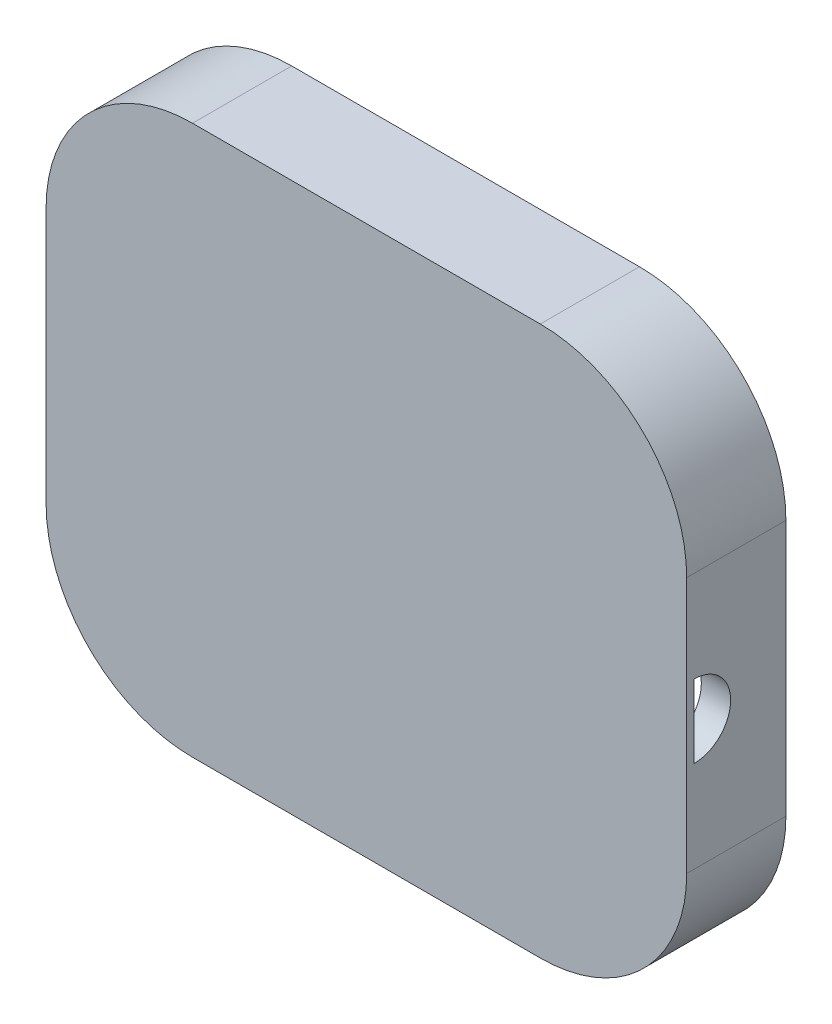
ISO-10303-21;
HEADER;
FILE_DESCRIPTION(('STEP AP214'),'2;1');
FILE_NAME('part.step','',(''),(''),'','','');
FILE_SCHEMA(('AUTOMOTIVE_DESIGN { 1 0 10303 214 1 1 1 1 }'));
ENDSEC;
DATA;
#1=APPLICATION_CONTEXT('core data for automotive mechanical design processes');
#2=APPLICATION_PROTOCOL_DEFINITION('international standard','automotive_design',2000,#1);
#3=PRODUCT_CONTEXT('',#1,'mechanical');
#4=PRODUCT('Part','Part','',(#3));
#5=PRODUCT_RELATED_PRODUCT_CATEGORY('part','',(#4));
#6=PRODUCT_DEFINITION_FORMATION('','',#4);
#7=PRODUCT_DEFINITION_CONTEXT('part definition',#1,'design');
#8=PRODUCT_DEFINITION('design','',#6,#7);
#9=PRODUCT_DEFINITION_SHAPE('','',#8);
#10=(LENGTH_UNIT() NAMED_UNIT(*) SI_UNIT(.MILLI.,.METRE.));
#11=(NAMED_UNIT(*) PLANE_ANGLE_UNIT() SI_UNIT($,.RADIAN.));
#12=(NAMED_UNIT(*) SI_UNIT($,.STERADIAN.) SOLID_ANGLE_UNIT());
#13=UNCERTAINTY_MEASURE_WITH_UNIT(LENGTH_MEASURE(1.E-05),#10,'distance_accuracy_value','');
#14=(GEOMETRIC_REPRESENTATION_CONTEXT(3) GLOBAL_UNCERTAINTY_ASSIGNED_CONTEXT((#13)) GLOBAL_UNIT_ASSIGNED_CONTEXT((#10,
#11,#12)) REPRESENTATION_CONTEXT('',''));
#15=CARTESIAN_POINT('',(0.,0.,0.));
#16=DIRECTION('',(0.,0.,1.));
#17=DIRECTION('',(1.,0.,0.));
#18=AXIS2_PLACEMENT_3D('',#15,#16,#17);
#19=CARTESIAN_POINT('',(-75.,75.,2.));
#20=DIRECTION('',(1.,0.,0.));
#21=DIRECTION('',(0.,1.,0.));
#22=AXIS2_PLACEMENT_3D('',#19,#20,#21);
#23=PLANE('',#22);
#24=DIRECTION('',(0.,0.,-1.));
#25=VECTOR('',#24,1.);
#26=CARTESIAN_POINT('',(-75.,35.,2.));
#27=LINE('',#26,#25);
#28=CARTESIAN_POINT('',(-75.,35.,2.));
#29=VERTEX_POINT('',#28);
#30=CARTESIAN_POINT('',(-75.,35.,-25.1));
#31=VERTEX_POINT('',#30);
#32=EDGE_CURVE('E299',#29,#31,#27,.T.);
#33=ORIENTED_EDGE('',*,*,#32,.T.);
#34=DIRECTION('',(0.,1.,0.));
#35=VECTOR('',#34,1.);
#36=CARTESIAN_POINT('',(-75.,-35.,-25.1));
#37=LINE('',#36,#35);
#38=CARTESIAN_POINT('',(-75.,-35.,-25.1));
#39=VERTEX_POINT('',#38);
#40=EDGE_CURVE('E277',#39,#31,#37,.T.);
#41=ORIENTED_EDGE('',*,*,#40,.F.);
#42=DIRECTION('',(0.,0.,-1.));
#43=VECTOR('',#42,1.);
#44=CARTESIAN_POINT('',(-75.,-35.,2.));
#45=LINE('',#44,#43);
#46=CARTESIAN_POINT('',(-75.,-35.,2.));
#47=VERTEX_POINT('',#46);
#48=EDGE_CURVE('E301',#39,#47,#45,.F.);
#49=ORIENTED_EDGE('',*,*,#48,.T.);
#50=DIRECTION('',(0.,-1.,0.));
#51=VECTOR('',#50,1.);
#52=CARTESIAN_POINT('',(-75.,75.,2.));
#53=LINE('',#52,#51);
#54=EDGE_CURVE('E289',#29,#47,#53,.T.);
#55=ORIENTED_EDGE('',*,*,#54,.F.);
#56=EDGE_LOOP('',(#33,#41,#49,#55));
#57=FACE_BOUND('',#56,.T.);
#58=ADVANCED_FACE('F39',(#57),#23,.F.);
#59=CARTESIAN_POINT('',(-75.,-75.,2.));
#60=DIRECTION('',(0.,1.,0.));
#61=DIRECTION('',(0.,0.,1.));
#62=AXIS2_PLACEMENT_3D('',#59,#60,#61);
#63=PLANE('',#62);
#64=DIRECTION('',(0.,0.,-1.));
#65=VECTOR('',#64,1.);
#66=CARTESIAN_POINT('',(-35.,-75.,2.));
#67=LINE('',#66,#65);
#68=CARTESIAN_POINT('',(-35.,-75.,2.));
#69=VERTEX_POINT('',#68);
#70=CARTESIAN_POINT('',(-35.,-75.,-25.1));
#71=VERTEX_POINT('',#70);
#72=EDGE_CURVE('E297',#69,#71,#67,.T.);
#73=ORIENTED_EDGE('',*,*,#72,.T.);
#74=DIRECTION('',(-1.,0.,0.));
#75=VECTOR('',#74,1.);
#76=CARTESIAN_POINT('',(60.,-75.,-25.1));
#77=LINE('',#76,#75);
#78=CARTESIAN_POINT('',(60.,-75.,-25.1));
#79=VERTEX_POINT('',#78);
#80=EDGE_CURVE('E271',#79,#71,#77,.T.);
#81=ORIENTED_EDGE('',*,*,#80,.F.);
#82=DIRECTION('',(0.,0.,1.));
#83=VECTOR('',#82,1.);
#84=CARTESIAN_POINT('',(60.,-75.,2.));
#85=LINE('',#84,#83);
#86=CARTESIAN_POINT('',(60.,-75.,2.));
#87=VERTEX_POINT('',#86);
#88=EDGE_CURVE('E11',#79,#87,#85,.T.);
#89=ORIENTED_EDGE('',*,*,#88,.T.);
#90=DIRECTION('',(1.,0.,0.));
#91=VECTOR('',#90,1.);
#92=CARTESIAN_POINT('',(-75.,-75.,2.));
#93=LINE('',#92,#91);
#94=EDGE_CURVE('E292',#69,#87,#93,.T.);
#95=ORIENTED_EDGE('',*,*,#94,.F.);
#96=EDGE_LOOP('',(#73,#81,#89,#95));
#97=FACE_BOUND('',#96,.T.);
#98=ADVANCED_FACE('F338',(#97),#63,.F.);
#99=CARTESIAN_POINT('',(-75.,75.,2.));
#100=DIRECTION('',(0.,-1.,0.));
#101=DIRECTION('',(0.,0.,-1.));
#102=AXIS2_PLACEMENT_3D('',#99,#100,#101);
#103=PLANE('',#102);
#104=DIRECTION('',(-1.,0.,0.));
#105=VECTOR('',#104,1.);
#106=CARTESIAN_POINT('',(-75.,75.,2.));
#107=LINE('',#106,#105);
#108=CARTESIAN_POINT('',(60.,75.,2.));
#109=VERTEX_POINT('',#108);
#110=CARTESIAN_POINT('',(-35.,75.,2.));
#111=VERTEX_POINT('',#110);
#112=EDGE_CURVE('E295',#109,#111,#107,.T.);
#113=ORIENTED_EDGE('',*,*,#112,.F.);
#114=DIRECTION('',(0.,0.,1.));
#115=VECTOR('',#114,1.);
#116=CARTESIAN_POINT('',(60.,75.,0.));
#117=LINE('',#116,#115);
#118=CARTESIAN_POINT('',(60.,75.,-25.1));
#119=VERTEX_POINT('',#118);
#120=EDGE_CURVE('E47',#109,#119,#117,.F.);
#121=ORIENTED_EDGE('',*,*,#120,.T.);
#122=DIRECTION('',(1.,0.,0.));
#123=VECTOR('',#122,1.);
#124=CARTESIAN_POINT('',(-35.,75.,-25.1));
#125=LINE('',#124,#123);
#126=CARTESIAN_POINT('',(-35.,75.,-25.1));
#127=VERTEX_POINT('',#126);
#128=EDGE_CURVE('E283',#127,#119,#125,.T.);
#129=ORIENTED_EDGE('',*,*,#128,.F.);
#130=DIRECTION('',(0.,0.,-1.));
#131=VECTOR('',#130,1.);
#132=CARTESIAN_POINT('',(-35.,75.,2.));
#133=LINE('',#132,#131);
#134=EDGE_CURVE('E307',#127,#111,#133,.F.);
#135=ORIENTED_EDGE('',*,*,#134,.T.);
#136=EDGE_LOOP('',(#113,#121,#129,#135));
#137=FACE_BOUND('',#136,.T.);
#138=ADVANCED_FACE('F322',(#137),#103,.F.);
#139=CARTESIAN_POINT('',(0.,0.,2.));
#140=DIRECTION('',(0.,0.,1.));
#141=DIRECTION('',(1.,0.,0.));
#142=AXIS2_PLACEMENT_3D('',#139,#140,#141);
#143=PLANE('',#142);
#144=DIRECTION('',(0.,1.,0.));
#145=VECTOR('',#144,1.);
#146=CARTESIAN_POINT('',(100.,-75.,2.));
#147=LINE('',#146,#145);
#148=CARTESIAN_POINT('',(100.,-35.,2.));
#149=VERTEX_POINT('',#148);
#150=CARTESIAN_POINT('',(100.,35.,2.));
#151=VERTEX_POINT('',#150);
#152=EDGE_CURVE('E286',#149,#151,#147,.T.);
#153=ORIENTED_EDGE('',*,*,#152,.T.);
#154=CARTESIAN_POINT('',(60.,35.,2.));
#155=DIRECTION('',(0.,0.,1.));
#156=DIRECTION('',(1.,0.,0.));
#157=AXIS2_PLACEMENT_3D('',#154,#155,#156);
#158=CIRCLE('',#157,40.);
#159=EDGE_CURVE('E317',#151,#109,#158,.T.);
#160=ORIENTED_EDGE('',*,*,#159,.T.);
#161=ORIENTED_EDGE('',*,*,#112,.T.);
#162=CARTESIAN_POINT('',(-35.,35.,2.));
#163=DIRECTION('',(0.,0.,1.));
#164=DIRECTION('',(1.,0.,0.));
#165=AXIS2_PLACEMENT_3D('',#162,#163,#164);
#166=CIRCLE('',#165,40.);
#167=EDGE_CURVE('E303',#111,#29,#166,.T.);
#168=ORIENTED_EDGE('',*,*,#167,.T.);
#169=ORIENTED_EDGE('',*,*,#54,.T.);
#170=CARTESIAN_POINT('',(-35.,-35.,2.));
#171=DIRECTION('',(0.,0.,1.));
#172=DIRECTION('',(1.,0.,0.));
#173=AXIS2_PLACEMENT_3D('',#170,#171,#172);
#174=CIRCLE('',#173,40.);
#175=EDGE_CURVE('E305',#47,#69,#174,.T.);
#176=ORIENTED_EDGE('',*,*,#175,.T.);
#177=ORIENTED_EDGE('',*,*,#94,.T.);
#178=CARTESIAN_POINT('',(60.,-35.,2.));
#179=DIRECTION('',(0.,0.,1.));
#180=DIRECTION('',(1.,0.,0.));
#181=AXIS2_PLACEMENT_3D('',#178,#179,#180);
#182=CIRCLE('',#181,40.);
#183=EDGE_CURVE('E315',#87,#149,#182,.T.);
#184=ORIENTED_EDGE('',*,*,#183,.T.);
#185=EDGE_LOOP('',(#153,#160,#161,#168,#169,#176,#177,#184));
#186=FACE_BOUND('',#185,.T.);
#187=ADVANCED_FACE('F341',(#186),#143,.T.);
#188=CARTESIAN_POINT('',(-35.,-35.,2.));
#189=DIRECTION('',(0.,0.,-1.));
#190=DIRECTION('',(-1.,0.,0.));
#191=AXIS2_PLACEMENT_3D('',#188,#189,#190);
#192=CYLINDRICAL_SURFACE('',#191,40.);
#193=ORIENTED_EDGE('',*,*,#175,.F.);
#194=ORIENTED_EDGE('',*,*,#48,.F.);
#195=CARTESIAN_POINT('',(-35.,-35.,-25.1));
#196=DIRECTION('',(0.,0.,-1.));
#197=DIRECTION('',(-1.,0.,0.));
#198=AXIS2_PLACEMENT_3D('',#195,#196,#197);
#199=CIRCLE('',#198,40.);
#200=EDGE_CURVE('E274',#71,#39,#199,.T.);
#201=ORIENTED_EDGE('',*,*,#200,.F.);
#202=ORIENTED_EDGE('',*,*,#72,.F.);
#203=EDGE_LOOP('',(#193,#194,#201,#202));
#204=FACE_BOUND('',#203,.T.);
#205=ADVANCED_FACE('F345',(#204),#192,.T.);
#206=CARTESIAN_POINT('',(-35.,35.,2.));
#207=DIRECTION('',(0.,0.,-1.));
#208=DIRECTION('',(-1.,0.,0.));
#209=AXIS2_PLACEMENT_3D('',#206,#207,#208);
#210=CYLINDRICAL_SURFACE('',#209,40.);
#211=ORIENTED_EDGE('',*,*,#167,.F.);
#212=ORIENTED_EDGE('',*,*,#134,.F.);
#213=CARTESIAN_POINT('',(-35.,35.,-25.1));
#214=DIRECTION('',(0.,0.,-1.));
#215=DIRECTION('',(-1.,0.,0.));
#216=AXIS2_PLACEMENT_3D('',#213,#214,#215);
#217=CIRCLE('',#216,40.);
#218=EDGE_CURVE('E280',#31,#127,#217,.T.);
#219=ORIENTED_EDGE('',*,*,#218,.F.);
#220=ORIENTED_EDGE('',*,*,#32,.F.);
#221=EDGE_LOOP('',(#211,#212,#219,#220));
#222=FACE_BOUND('',#221,.T.);
#223=ADVANCED_FACE('F352',(#222),#210,.T.);
#224=CARTESIAN_POINT('',(100.,-75.,0.));
#225=DIRECTION('',(1.,0.,0.));
#226=DIRECTION('',(0.,0.,-1.));
#227=AXIS2_PLACEMENT_3D('',#224,#225,#226);
#228=PLANE('',#227);
#229=CARTESIAN_POINT('',(100.,0.,0.));
#230=DIRECTION('',(1.,0.,0.));
#231=DIRECTION('',(0.,0.,-1.));
#232=AXIS2_PLACEMENT_3D('',#229,#230,#231);
#233=CIRCLE('',#232,10.);
#234=CARTESIAN_POINT('',(100.,-10.,0.));
#235=VERTEX_POINT('',#234);
#236=CARTESIAN_POINT('',(100.,9.99999999999999,0.));
#237=VERTEX_POINT('',#236);
#238=EDGE_CURVE('E54',#235,#237,#233,.T.);
#239=ORIENTED_EDGE('',*,*,#238,.F.);
#240=DIRECTION('',(0.,-1.,0.));
#241=VECTOR('',#240,1.);
#242=CARTESIAN_POINT('',(100.,10.,0.));
#243=LINE('',#242,#241);
#244=EDGE_CURVE('E168',#237,#235,#243,.T.);
#245=ORIENTED_EDGE('',*,*,#244,.F.);
#246=EDGE_LOOP('',(#239,#245));
#247=FACE_BOUND('',#246,.T.);
#248=DIRECTION('',(0.,0.,1.));
#249=VECTOR('',#248,1.);
#250=CARTESIAN_POINT('',(100.,-35.,0.));
#251=LINE('',#250,#249);
#252=CARTESIAN_POINT('',(100.,-35.,-25.1));
#253=VERTEX_POINT('',#252);
#254=EDGE_CURVE('E310',#149,#253,#251,.F.);
#255=ORIENTED_EDGE('',*,*,#254,.T.);
#256=DIRECTION('',(0.,-1.,0.));
#257=VECTOR('',#256,1.);
#258=CARTESIAN_POINT('',(100.,35.,-25.1));
#259=LINE('',#258,#257);
#260=CARTESIAN_POINT('',(100.,35.,-25.1));
#261=VERTEX_POINT('',#260);
#262=EDGE_CURVE('E265',#261,#253,#259,.T.);
#263=ORIENTED_EDGE('',*,*,#262,.F.);
#264=DIRECTION('',(0.,0.,1.));
#265=VECTOR('',#264,1.);
#266=CARTESIAN_POINT('',(100.,35.,2.));
#267=LINE('',#266,#265);
#268=EDGE_CURVE('E312',#261,#151,#267,.T.);
#269=ORIENTED_EDGE('',*,*,#268,.T.);
#270=ORIENTED_EDGE('',*,*,#152,.F.);
#271=EDGE_LOOP('',(#255,#263,#269,#270));
#272=FACE_BOUND('',#271,.T.);
#273=ADVANCED_FACE('F173',(#247,#272),#228,.T.);
#274=CARTESIAN_POINT('',(60.,35.,0.));
#275=DIRECTION('',(0.,0.,-1.));
#276=DIRECTION('',(-1.,0.,0.));
#277=AXIS2_PLACEMENT_3D('',#274,#275,#276);
#278=CYLINDRICAL_SURFACE('',#277,40.);
#279=ORIENTED_EDGE('',*,*,#268,.F.);
#280=CARTESIAN_POINT('',(60.,35.,-25.1));
#281=DIRECTION('',(0.,0.,-1.));
#282=DIRECTION('',(-1.,0.,0.));
#283=AXIS2_PLACEMENT_3D('',#280,#281,#282);
#284=CIRCLE('',#283,40.);
#285=EDGE_CURVE('E262',#119,#261,#284,.T.);
#286=ORIENTED_EDGE('',*,*,#285,.F.);
#287=ORIENTED_EDGE('',*,*,#120,.F.);
#288=ORIENTED_EDGE('',*,*,#159,.F.);
#289=EDGE_LOOP('',(#279,#286,#287,#288));
#290=FACE_BOUND('',#289,.T.);
#291=ADVANCED_FACE('F329',(#290),#278,.T.);
#292=CARTESIAN_POINT('',(60.,-35.,2.));
#293=DIRECTION('',(0.,0.,-1.));
#294=DIRECTION('',(-1.,0.,0.));
#295=AXIS2_PLACEMENT_3D('',#292,#293,#294);
#296=CYLINDRICAL_SURFACE('',#295,40.);
#297=ORIENTED_EDGE('',*,*,#88,.F.);
#298=CARTESIAN_POINT('',(60.,-35.,-25.1));
#299=DIRECTION('',(0.,0.,-1.));
#300=DIRECTION('',(-1.,0.,0.));
#301=AXIS2_PLACEMENT_3D('',#298,#299,#300);
#302=CIRCLE('',#301,40.);
#303=EDGE_CURVE('E268',#253,#79,#302,.T.);
#304=ORIENTED_EDGE('',*,*,#303,.F.);
#305=ORIENTED_EDGE('',*,*,#254,.F.);
#306=ORIENTED_EDGE('',*,*,#183,.F.);
#307=EDGE_LOOP('',(#297,#304,#305,#306));
#308=FACE_BOUND('',#307,.T.);
#309=ADVANCED_FACE('F41',(#308),#296,.T.);
#310=CARTESIAN_POINT('',(60.,35.,-25.1));
#311=DIRECTION('',(0.,0.,-1.));
#312=DIRECTION('',(-1.,0.,0.));
#313=AXIS2_PLACEMENT_3D('',#310,#311,#312);
#314=PLANE('',#313);
#315=CARTESIAN_POINT('',(96.,0.,-25.1));
#316=DIRECTION('',(0.,0.,-1.));
#317=DIRECTION('',(-1.,0.,0.));
#318=AXIS2_PLACEMENT_3D('',#315,#316,#317);
#319=CIRCLE('',#318,1.45);
#320=CARTESIAN_POINT('',(94.55,0.,-25.1));
#321=VERTEX_POINT('',#320);
#322=EDGE_CURVE('E184',#321,#321,#319,.T.);
#323=ORIENTED_EDGE('',*,*,#322,.F.);
#324=EDGE_LOOP('',(#323));
#325=FACE_BOUND('',#324,.T.);
#326=CARTESIAN_POINT('',(12.5,71.,-25.1));
#327=DIRECTION('',(0.,0.,-1.));
#328=DIRECTION('',(-1.,0.,0.));
#329=AXIS2_PLACEMENT_3D('',#326,#327,#328);
#330=CIRCLE('',#329,1.45000000000001);
#331=CARTESIAN_POINT('',(11.05,71.,-25.1));
#332=VERTEX_POINT('',#331);
#333=EDGE_CURVE('E187',#332,#332,#330,.T.);
#334=ORIENTED_EDGE('',*,*,#333,.F.);
#335=EDGE_LOOP('',(#334));
#336=FACE_BOUND('',#335,.T.);
#337=CARTESIAN_POINT('',(-71.,0.,-25.1));
#338=DIRECTION('',(0.,0.,-1.));
#339=DIRECTION('',(-1.,0.,0.));
#340=AXIS2_PLACEMENT_3D('',#337,#338,#339);
#341=CIRCLE('',#340,1.45);
#342=CARTESIAN_POINT('',(-72.45,0.,-25.1));
#343=VERTEX_POINT('',#342);
#344=EDGE_CURVE('E193',#343,#343,#341,.T.);
#345=ORIENTED_EDGE('',*,*,#344,.F.);
#346=EDGE_LOOP('',(#345));
#347=FACE_BOUND('',#346,.T.);
#348=CARTESIAN_POINT('',(12.5,-71.,-25.1));
#349=DIRECTION('',(0.,0.,-1.));
#350=DIRECTION('',(-1.,0.,0.));
#351=AXIS2_PLACEMENT_3D('',#348,#349,#350);
#352=CIRCLE('',#351,1.45);
#353=CARTESIAN_POINT('',(11.05,-71.,-25.1));
#354=VERTEX_POINT('',#353);
#355=EDGE_CURVE('E199',#354,#354,#352,.T.);
#356=ORIENTED_EDGE('',*,*,#355,.F.);
#357=EDGE_LOOP('',(#356));
#358=FACE_BOUND('',#357,.T.);
#359=ORIENTED_EDGE('',*,*,#285,.T.);
#360=ORIENTED_EDGE('',*,*,#262,.T.);
#361=ORIENTED_EDGE('',*,*,#303,.T.);
#362=ORIENTED_EDGE('',*,*,#80,.T.);
#363=ORIENTED_EDGE('',*,*,#200,.T.);
#364=ORIENTED_EDGE('',*,*,#40,.T.);
#365=ORIENTED_EDGE('',*,*,#218,.T.);
#366=ORIENTED_EDGE('',*,*,#128,.T.);
#367=EDGE_LOOP('',(#359,#360,#361,#362,#363,#364,#365,#366));
#368=FACE_BOUND('',#367,.T.);
#369=DIRECTION('',(0.,-1.,0.));
#370=VECTOR('',#369,1.);
#371=CARTESIAN_POINT('',(92.,35.,-25.1));
#372=LINE('',#371,#370);
#373=CARTESIAN_POINT('',(92.,35.,-25.1));
#374=VERTEX_POINT('',#373);
#375=CARTESIAN_POINT('',(92.,-35.,-25.1));
#376=VERTEX_POINT('',#375);
#377=EDGE_CURVE('E206',#374,#376,#372,.T.);
#378=ORIENTED_EDGE('',*,*,#377,.F.);
#379=CARTESIAN_POINT('',(60.,35.,-25.1));
#380=DIRECTION('',(0.,0.,-1.));
#381=DIRECTION('',(-1.,0.,0.));
#382=AXIS2_PLACEMENT_3D('',#379,#380,#381);
#383=CIRCLE('',#382,32.);
#384=CARTESIAN_POINT('',(60.,67.,-25.1));
#385=VERTEX_POINT('',#384);
#386=EDGE_CURVE('E204',#385,#374,#383,.T.);
#387=ORIENTED_EDGE('',*,*,#386,.F.);
#388=DIRECTION('',(1.,0.,0.));
#389=VECTOR('',#388,1.);
#390=CARTESIAN_POINT('',(-35.,67.,-25.1));
#391=LINE('',#390,#389);
#392=CARTESIAN_POINT('',(-35.,67.,-25.1));
#393=VERTEX_POINT('',#392);
#394=EDGE_CURVE('E220',#393,#385,#391,.T.);
#395=ORIENTED_EDGE('',*,*,#394,.F.);
#396=CARTESIAN_POINT('',(-35.,35.,-25.1));
#397=DIRECTION('',(0.,0.,-1.));
#398=DIRECTION('',(-1.,0.,0.));
#399=AXIS2_PLACEMENT_3D('',#396,#397,#398);
#400=CIRCLE('',#399,32.);
#401=CARTESIAN_POINT('',(-67.,35.,-25.1));
#402=VERTEX_POINT('',#401);
#403=EDGE_CURVE('E217',#402,#393,#400,.T.);
#404=ORIENTED_EDGE('',*,*,#403,.F.);
#405=DIRECTION('',(0.,1.,0.));
#406=VECTOR('',#405,1.);
#407=CARTESIAN_POINT('',(-67.,-35.,-25.1));
#408=LINE('',#407,#406);
#409=CARTESIAN_POINT('',(-67.,-35.,-25.1));
#410=VERTEX_POINT('',#409);
#411=EDGE_CURVE('E215',#410,#402,#408,.T.);
#412=ORIENTED_EDGE('',*,*,#411,.F.);
#413=CARTESIAN_POINT('',(-35.,-35.,-25.1));
#414=DIRECTION('',(0.,0.,-1.));
#415=DIRECTION('',(-1.,0.,0.));
#416=AXIS2_PLACEMENT_3D('',#413,#414,#415);
#417=CIRCLE('',#416,32.);
#418=CARTESIAN_POINT('',(-35.,-67.,-25.1));
#419=VERTEX_POINT('',#418);
#420=EDGE_CURVE('E213',#419,#410,#417,.T.);
#421=ORIENTED_EDGE('',*,*,#420,.F.);
#422=DIRECTION('',(-1.,0.,0.));
#423=VECTOR('',#422,1.);
#424=CARTESIAN_POINT('',(60.,-67.,-25.1));
#425=LINE('',#424,#423);
#426=CARTESIAN_POINT('',(60.,-67.,-25.1));
#427=VERTEX_POINT('',#426);
#428=EDGE_CURVE('E211',#427,#419,#425,.T.);
#429=ORIENTED_EDGE('',*,*,#428,.F.);
#430=CARTESIAN_POINT('',(60.,-35.,-25.1));
#431=DIRECTION('',(0.,0.,-1.));
#432=DIRECTION('',(-1.,0.,0.));
#433=AXIS2_PLACEMENT_3D('',#430,#431,#432);
#434=CIRCLE('',#433,32.);
#435=EDGE_CURVE('E209',#376,#427,#434,.T.);
#436=ORIENTED_EDGE('',*,*,#435,.F.);
#437=EDGE_LOOP('',(#378,#387,#395,#404,#412,#421,#429,#436));
#438=FACE_BOUND('',#437,.T.);
#439=ADVANCED_FACE('F326',(#325,#336,#347,#358,#368,#438),#314,.T.);
#440=CARTESIAN_POINT('',(60.,35.,-25.1));
#441=DIRECTION('',(0.,0.,1.));
#442=DIRECTION('',(1.,0.,0.));
#443=AXIS2_PLACEMENT_3D('',#440,#441,#442);
#444=CYLINDRICAL_SURFACE('',#443,32.);
#445=CARTESIAN_POINT('',(60.,35.,0.));
#446=DIRECTION('',(0.,0.,-1.));
#447=DIRECTION('',(-1.,0.,0.));
#448=AXIS2_PLACEMENT_3D('',#445,#446,#447);
#449=CIRCLE('',#448,32.);
#450=CARTESIAN_POINT('',(60.,67.,0.));
#451=VERTEX_POINT('',#450);
#452=CARTESIAN_POINT('',(92.,35.,0.));
#453=VERTEX_POINT('',#452);
#454=EDGE_CURVE('E183',#451,#453,#449,.T.);
#455=ORIENTED_EDGE('',*,*,#454,.F.);
#456=DIRECTION('',(0.,0.,1.));
#457=VECTOR('',#456,1.);
#458=CARTESIAN_POINT('',(60.,67.,-25.1));
#459=LINE('',#458,#457);
#460=EDGE_CURVE('E222',#385,#451,#459,.T.);
#461=ORIENTED_EDGE('',*,*,#460,.F.);
#462=ORIENTED_EDGE('',*,*,#386,.T.);
#463=DIRECTION('',(0.,0.,1.));
#464=VECTOR('',#463,1.);
#465=CARTESIAN_POINT('',(92.,35.,-25.1));
#466=LINE('',#465,#464);
#467=EDGE_CURVE('E259',#374,#453,#466,.T.);
#468=ORIENTED_EDGE('',*,*,#467,.T.);
#469=EDGE_LOOP('',(#455,#461,#462,#468));
#470=FACE_BOUND('',#469,.T.);
#471=ADVANCED_FACE('F379',(#470),#444,.F.);
#472=CARTESIAN_POINT('',(92.,35.,-25.1));
#473=DIRECTION('',(-1.,0.,0.));
#474=DIRECTION('',(0.,0.,1.));
#475=AXIS2_PLACEMENT_3D('',#472,#473,#474);
#476=PLANE('',#475);
#477=CARTESIAN_POINT('',(92.,0.,0.));
#478=DIRECTION('',(-1.,0.,0.));
#479=DIRECTION('',(0.,0.,1.));
#480=AXIS2_PLACEMENT_3D('',#477,#478,#479);
#481=CIRCLE('',#480,10.);
#482=CARTESIAN_POINT('',(92.,10.,0.));
#483=VERTEX_POINT('',#482);
#484=CARTESIAN_POINT('',(92.,-10.,0.));
#485=VERTEX_POINT('',#484);
#486=EDGE_CURVE('E163',#483,#485,#481,.T.);
#487=ORIENTED_EDGE('',*,*,#486,.F.);
#488=DIRECTION('',(0.,-1.,0.));
#489=VECTOR('',#488,1.);
#490=CARTESIAN_POINT('',(92.,35.,0.));
#491=LINE('',#490,#489);
#492=EDGE_CURVE('E226',#453,#483,#491,.T.);
#493=ORIENTED_EDGE('',*,*,#492,.F.);
#494=ORIENTED_EDGE('',*,*,#467,.F.);
#495=ORIENTED_EDGE('',*,*,#377,.T.);
#496=DIRECTION('',(0.,0.,1.));
#497=VECTOR('',#496,1.);
#498=CARTESIAN_POINT('',(92.,-35.,-25.1));
#499=LINE('',#498,#497);
#500=CARTESIAN_POINT('',(92.,-35.,0.));
#501=VERTEX_POINT('',#500);
#502=EDGE_CURVE('E256',#376,#501,#499,.T.);
#503=ORIENTED_EDGE('',*,*,#502,.T.);
#504=EDGE_CURVE('E225',#485,#501,#491,.T.);
#505=ORIENTED_EDGE('',*,*,#504,.F.);
#506=EDGE_LOOP('',(#487,#493,#494,#495,#503,#505));
#507=FACE_BOUND('',#506,.T.);
#508=ADVANCED_FACE('F383',(#507),#476,.T.);
#509=CARTESIAN_POINT('',(60.,-35.,-25.1));
#510=DIRECTION('',(0.,0.,1.));
#511=DIRECTION('',(1.,0.,0.));
#512=AXIS2_PLACEMENT_3D('',#509,#510,#511);
#513=CYLINDRICAL_SURFACE('',#512,32.);
#514=CARTESIAN_POINT('',(60.,-35.,0.));
#515=DIRECTION('',(0.,0.,-1.));
#516=DIRECTION('',(-1.,0.,0.));
#517=AXIS2_PLACEMENT_3D('',#514,#515,#516);
#518=CIRCLE('',#517,32.);
#519=CARTESIAN_POINT('',(60.,-67.,0.));
#520=VERTEX_POINT('',#519);
#521=EDGE_CURVE('E228',#501,#520,#518,.T.);
#522=ORIENTED_EDGE('',*,*,#521,.F.);
#523=ORIENTED_EDGE('',*,*,#502,.F.);
#524=ORIENTED_EDGE('',*,*,#435,.T.);
#525=DIRECTION('',(0.,0.,1.));
#526=VECTOR('',#525,1.);
#527=CARTESIAN_POINT('',(60.,-67.,-25.1));
#528=LINE('',#527,#526);
#529=EDGE_CURVE('E254',#427,#520,#528,.T.);
#530=ORIENTED_EDGE('',*,*,#529,.T.);
#531=EDGE_LOOP('',(#522,#523,#524,#530));
#532=FACE_BOUND('',#531,.T.);
#533=ADVANCED_FACE('F387',(#532),#513,.F.);
#534=CARTESIAN_POINT('',(60.,-67.,-25.1));
#535=DIRECTION('',(0.,1.,0.));
#536=DIRECTION('',(0.,0.,1.));
#537=AXIS2_PLACEMENT_3D('',#534,#535,#536);
#538=PLANE('',#537);
#539=DIRECTION('',(-1.,0.,0.));
#540=VECTOR('',#539,1.);
#541=CARTESIAN_POINT('',(60.,-67.,0.));
#542=LINE('',#541,#540);
#543=CARTESIAN_POINT('',(-35.,-67.,0.));
#544=VERTEX_POINT('',#543);
#545=EDGE_CURVE('E231',#520,#544,#542,.T.);
#546=ORIENTED_EDGE('',*,*,#545,.F.);
#547=ORIENTED_EDGE('',*,*,#529,.F.);
#548=ORIENTED_EDGE('',*,*,#428,.T.);
#549=DIRECTION('',(0.,0.,1.));
#550=VECTOR('',#549,1.);
#551=CARTESIAN_POINT('',(-35.,-67.,-25.1));
#552=LINE('',#551,#550);
#553=EDGE_CURVE('E252',#419,#544,#552,.T.);
#554=ORIENTED_EDGE('',*,*,#553,.T.);
#555=EDGE_LOOP('',(#546,#547,#548,#554));
#556=FACE_BOUND('',#555,.T.);
#557=ADVANCED_FACE('F391',(#556),#538,.T.);
#558=CARTESIAN_POINT('',(-35.,-35.,-25.1));
#559=DIRECTION('',(0.,0.,1.));
#560=DIRECTION('',(1.,0.,0.));
#561=AXIS2_PLACEMENT_3D('',#558,#559,#560);
#562=CYLINDRICAL_SURFACE('',#561,32.);
#563=CARTESIAN_POINT('',(-35.,-35.,0.));
#564=DIRECTION('',(0.,0.,-1.));
#565=DIRECTION('',(-1.,0.,0.));
#566=AXIS2_PLACEMENT_3D('',#563,#564,#565);
#567=CIRCLE('',#566,32.);
#568=CARTESIAN_POINT('',(-67.,-35.,0.));
#569=VERTEX_POINT('',#568);
#570=EDGE_CURVE('E234',#544,#569,#567,.T.);
#571=ORIENTED_EDGE('',*,*,#570,.F.);
#572=ORIENTED_EDGE('',*,*,#553,.F.);
#573=ORIENTED_EDGE('',*,*,#420,.T.);
#574=DIRECTION('',(0.,0.,1.));
#575=VECTOR('',#574,1.);
#576=CARTESIAN_POINT('',(-67.,-35.,-25.1));
#577=LINE('',#576,#575);
#578=EDGE_CURVE('E250',#410,#569,#577,.T.);
#579=ORIENTED_EDGE('',*,*,#578,.T.);
#580=EDGE_LOOP('',(#571,#572,#573,#579));
#581=FACE_BOUND('',#580,.T.);
#582=ADVANCED_FACE('F395',(#581),#562,.F.);
#583=CARTESIAN_POINT('',(-67.,-35.,-25.1));
#584=DIRECTION('',(1.,0.,0.));
#585=DIRECTION('',(0.,0.,-1.));
#586=AXIS2_PLACEMENT_3D('',#583,#584,#585);
#587=PLANE('',#586);
#588=DIRECTION('',(0.,1.,0.));
#589=VECTOR('',#588,1.);
#590=CARTESIAN_POINT('',(-67.,-35.,0.));
#591=LINE('',#590,#589);
#592=CARTESIAN_POINT('',(-67.,35.,0.));
#593=VERTEX_POINT('',#592);
#594=EDGE_CURVE('E237',#569,#593,#591,.T.);
#595=ORIENTED_EDGE('',*,*,#594,.F.);
#596=ORIENTED_EDGE('',*,*,#578,.F.);
#597=ORIENTED_EDGE('',*,*,#411,.T.);
#598=DIRECTION('',(0.,0.,1.));
#599=VECTOR('',#598,1.);
#600=CARTESIAN_POINT('',(-67.,35.,-25.1));
#601=LINE('',#600,#599);
#602=EDGE_CURVE('E248',#402,#593,#601,.T.);
#603=ORIENTED_EDGE('',*,*,#602,.T.);
#604=EDGE_LOOP('',(#595,#596,#597,#603));
#605=FACE_BOUND('',#604,.T.);
#606=ADVANCED_FACE('F399',(#605),#587,.T.);
#607=CARTESIAN_POINT('',(-35.,35.,-25.1));
#608=DIRECTION('',(0.,0.,1.));
#609=DIRECTION('',(1.,0.,0.));
#610=AXIS2_PLACEMENT_3D('',#607,#608,#609);
#611=CYLINDRICAL_SURFACE('',#610,32.);
#612=CARTESIAN_POINT('',(-35.,35.,0.));
#613=DIRECTION('',(0.,0.,-1.));
#614=DIRECTION('',(-1.,0.,0.));
#615=AXIS2_PLACEMENT_3D('',#612,#613,#614);
#616=CIRCLE('',#615,32.);
#617=CARTESIAN_POINT('',(-35.,67.,0.));
#618=VERTEX_POINT('',#617);
#619=EDGE_CURVE('E240',#593,#618,#616,.T.);
#620=ORIENTED_EDGE('',*,*,#619,.F.);
#621=ORIENTED_EDGE('',*,*,#602,.F.);
#622=ORIENTED_EDGE('',*,*,#403,.T.);
#623=DIRECTION('',(0.,0.,1.));
#624=VECTOR('',#623,1.);
#625=CARTESIAN_POINT('',(-35.,67.,-25.1));
#626=LINE('',#625,#624);
#627=EDGE_CURVE('E246',#393,#618,#626,.T.);
#628=ORIENTED_EDGE('',*,*,#627,.T.);
#629=EDGE_LOOP('',(#620,#621,#622,#628));
#630=FACE_BOUND('',#629,.T.);
#631=ADVANCED_FACE('F403',(#630),#611,.F.);
#632=CARTESIAN_POINT('',(-35.,67.,-25.1));
#633=DIRECTION('',(0.,-1.,0.));
#634=DIRECTION('',(1.,0.,0.));
#635=AXIS2_PLACEMENT_3D('',#632,#633,#634);
#636=PLANE('',#635);
#637=DIRECTION('',(1.,0.,0.));
#638=VECTOR('',#637,1.);
#639=CARTESIAN_POINT('',(-35.,67.,0.));
#640=LINE('',#639,#638);
#641=EDGE_CURVE('E207',#618,#451,#640,.T.);
#642=ORIENTED_EDGE('',*,*,#641,.F.);
#643=ORIENTED_EDGE('',*,*,#627,.F.);
#644=ORIENTED_EDGE('',*,*,#394,.T.);
#645=ORIENTED_EDGE('',*,*,#460,.T.);
#646=EDGE_LOOP('',(#642,#643,#644,#645));
#647=FACE_BOUND('',#646,.T.);
#648=ADVANCED_FACE('F375',(#647),#636,.T.);
#649=CARTESIAN_POINT('',(0.,0.,0.));
#650=DIRECTION('',(0.,0.,1.));
#651=DIRECTION('',(1.,0.,0.));
#652=AXIS2_PLACEMENT_3D('',#649,#650,#651);
#653=PLANE('',#652);
#654=ORIENTED_EDGE('',*,*,#492,.T.);
#655=DIRECTION('',(1.,0.,0.));
#656=VECTOR('',#655,1.);
#657=CARTESIAN_POINT('',(58.,10.,0.));
#658=LINE('',#657,#656);
#659=EDGE_CURVE('E165',#483,#237,#658,.T.);
#660=ORIENTED_EDGE('',*,*,#659,.T.);
#661=ORIENTED_EDGE('',*,*,#244,.T.);
#662=DIRECTION('',(1.,0.,0.));
#663=VECTOR('',#662,1.);
#664=CARTESIAN_POINT('',(58.,-10.,0.));
#665=LINE('',#664,#663);
#666=EDGE_CURVE('E61',#485,#235,#665,.T.);
#667=ORIENTED_EDGE('',*,*,#666,.F.);
#668=ORIENTED_EDGE('',*,*,#504,.T.);
#669=ORIENTED_EDGE('',*,*,#521,.T.);
#670=ORIENTED_EDGE('',*,*,#545,.T.);
#671=ORIENTED_EDGE('',*,*,#570,.T.);
#672=ORIENTED_EDGE('',*,*,#594,.T.);
#673=ORIENTED_EDGE('',*,*,#619,.T.);
#674=ORIENTED_EDGE('',*,*,#641,.T.);
#675=ORIENTED_EDGE('',*,*,#454,.T.);
#676=EDGE_LOOP('',(#654,#660,#661,#667,#668,#669,#670,#671,#672,#673,#674,#675));
#677=FACE_BOUND('',#676,.T.);
#678=ADVANCED_FACE('F170',(#677),#653,.F.);
#679=CARTESIAN_POINT('',(12.5,-71.,-17.1));
#680=DIRECTION('',(0.,0.,-1.));
#681=DIRECTION('',(-1.,0.,0.));
#682=AXIS2_PLACEMENT_3D('',#679,#680,#681);
#683=CYLINDRICAL_SURFACE('',#682,1.45);
#684=CARTESIAN_POINT('',(12.5,-71.,-17.1));
#685=DIRECTION('',(0.,0.,-1.));
#686=DIRECTION('',(-1.,0.,0.));
#687=AXIS2_PLACEMENT_3D('',#684,#685,#686);
#688=CIRCLE('',#687,1.45);
#689=CARTESIAN_POINT('',(11.05,-71.,-17.1));
#690=VERTEX_POINT('',#689);
#691=EDGE_CURVE('E179',#690,#690,#688,.T.);
#692=ORIENTED_EDGE('',*,*,#691,.F.);
#693=EDGE_LOOP('',(#692));
#694=FACE_BOUND('',#693,.T.);
#695=ORIENTED_EDGE('',*,*,#355,.T.);
#696=EDGE_LOOP('',(#695));
#697=FACE_BOUND('',#696,.T.);
#698=ADVANCED_FACE('F374',(#694,#697),#683,.F.);
#699=CARTESIAN_POINT('',(12.5,-71.,-17.1));
#700=DIRECTION('',(0.,0.,-1.));
#701=DIRECTION('',(-1.,0.,0.));
#702=AXIS2_PLACEMENT_3D('',#699,#700,#701);
#703=PLANE('',#702);
#704=ORIENTED_EDGE('',*,*,#691,.T.);
#705=EDGE_LOOP('',(#704));
#706=FACE_BOUND('',#705,.T.);
#707=ADVANCED_FACE('F411',(#706),#703,.T.);
#708=CARTESIAN_POINT('',(-71.,0.,-17.1));
#709=DIRECTION('',(0.,0.,-1.));
#710=DIRECTION('',(-1.,0.,0.));
#711=AXIS2_PLACEMENT_3D('',#708,#709,#710);
#712=CYLINDRICAL_SURFACE('',#711,1.45);
#713=CARTESIAN_POINT('',(-71.,0.,-17.1));
#714=DIRECTION('',(0.,0.,-1.));
#715=DIRECTION('',(-1.,0.,0.));
#716=AXIS2_PLACEMENT_3D('',#713,#714,#715);
#717=CIRCLE('',#716,1.45);
#718=CARTESIAN_POINT('',(-72.45,0.,-17.1));
#719=VERTEX_POINT('',#718);
#720=EDGE_CURVE('E196',#719,#719,#717,.T.);
#721=ORIENTED_EDGE('',*,*,#720,.F.);
#722=EDGE_LOOP('',(#721));
#723=FACE_BOUND('',#722,.T.);
#724=ORIENTED_EDGE('',*,*,#344,.T.);
#725=EDGE_LOOP('',(#724));
#726=FACE_BOUND('',#725,.T.);
#727=ADVANCED_FACE('F414',(#723,#726),#712,.F.);
#728=CARTESIAN_POINT('',(-71.,0.,-17.1));
#729=DIRECTION('',(0.,0.,-1.));
#730=DIRECTION('',(-1.,0.,0.));
#731=AXIS2_PLACEMENT_3D('',#728,#729,#730);
#732=PLANE('',#731);
#733=ORIENTED_EDGE('',*,*,#720,.T.);
#734=EDGE_LOOP('',(#733));
#735=FACE_BOUND('',#734,.T.);
#736=ADVANCED_FACE('F419',(#735),#732,.T.);
#737=CARTESIAN_POINT('',(12.5,71.,-17.1));
#738=DIRECTION('',(0.,0.,-1.));
#739=DIRECTION('',(-1.,0.,0.));
#740=AXIS2_PLACEMENT_3D('',#737,#738,#739);
#741=CYLINDRICAL_SURFACE('',#740,1.45000000000001);
#742=CARTESIAN_POINT('',(12.5,71.,-17.1));
#743=DIRECTION('',(0.,0.,-1.));
#744=DIRECTION('',(-1.,0.,0.));
#745=AXIS2_PLACEMENT_3D('',#742,#743,#744);
#746=CIRCLE('',#745,1.45000000000001);
#747=CARTESIAN_POINT('',(11.05,71.,-17.1));
#748=VERTEX_POINT('',#747);
#749=EDGE_CURVE('E190',#748,#748,#746,.T.);
#750=ORIENTED_EDGE('',*,*,#749,.F.);
#751=EDGE_LOOP('',(#750));
#752=FACE_BOUND('',#751,.T.);
#753=ORIENTED_EDGE('',*,*,#333,.T.);
#754=EDGE_LOOP('',(#753));
#755=FACE_BOUND('',#754,.T.);
#756=ADVANCED_FACE('F422',(#752,#755),#741,.F.);
#757=CARTESIAN_POINT('',(12.5,71.,-17.1));
#758=DIRECTION('',(0.,0.,-1.));
#759=DIRECTION('',(-1.,0.,0.));
#760=AXIS2_PLACEMENT_3D('',#757,#758,#759);
#761=PLANE('',#760);
#762=ORIENTED_EDGE('',*,*,#749,.T.);
#763=EDGE_LOOP('',(#762));
#764=FACE_BOUND('',#763,.T.);
#765=ADVANCED_FACE('F427',(#764),#761,.T.);
#766=CARTESIAN_POINT('',(96.,0.,-17.1));
#767=DIRECTION('',(0.,0.,-1.));
#768=DIRECTION('',(-1.,0.,0.));
#769=AXIS2_PLACEMENT_3D('',#766,#767,#768);
#770=CYLINDRICAL_SURFACE('',#769,1.45);
#771=CARTESIAN_POINT('',(96.,0.,-17.1));
#772=DIRECTION('',(0.,0.,-1.));
#773=DIRECTION('',(-1.,0.,0.));
#774=AXIS2_PLACEMENT_3D('',#771,#772,#773);
#775=CIRCLE('',#774,1.45);
#776=CARTESIAN_POINT('',(94.55,0.,-17.1));
#777=VERTEX_POINT('',#776);
#778=EDGE_CURVE('E180',#777,#777,#775,.T.);
#779=ORIENTED_EDGE('',*,*,#778,.F.);
#780=EDGE_LOOP('',(#779));
#781=FACE_BOUND('',#780,.T.);
#782=ORIENTED_EDGE('',*,*,#322,.T.);
#783=EDGE_LOOP('',(#782));
#784=FACE_BOUND('',#783,.T.);
#785=ADVANCED_FACE('F430',(#781,#784),#770,.F.);
#786=CARTESIAN_POINT('',(96.,0.,-17.1));
#787=DIRECTION('',(0.,0.,-1.));
#788=DIRECTION('',(-1.,0.,0.));
#789=AXIS2_PLACEMENT_3D('',#786,#787,#788);
#790=PLANE('',#789);
#791=ORIENTED_EDGE('',*,*,#778,.T.);
#792=EDGE_LOOP('',(#791));
#793=FACE_BOUND('',#792,.T.);
#794=ADVANCED_FACE('F437',(#793),#790,.T.);
#795=CARTESIAN_POINT('',(58.,0.,0.));
#796=DIRECTION('',(1.,0.,0.));
#797=DIRECTION('',(0.,0.,-1.));
#798=AXIS2_PLACEMENT_3D('',#795,#796,#797);
#799=CYLINDRICAL_SURFACE('',#798,10.);
#800=ORIENTED_EDGE('',*,*,#486,.T.);
#801=ORIENTED_EDGE('',*,*,#666,.T.);
#802=ORIENTED_EDGE('',*,*,#238,.T.);
#803=ORIENTED_EDGE('',*,*,#659,.F.);
#804=EDGE_LOOP('',(#800,#801,#802,#803));
#805=FACE_BOUND('',#804,.T.);
#806=ADVANCED_FACE('F161',(#805),#799,.F.);
#807=CLOSED_SHELL('',(#58,#98,#138,#187,#205,#223,#273,#291,#309,#439,#471,#508,#533,#557,#582,
#606,#631,#648,#678,#698,#707,#727,#736,#756,#765,#785,#794,#806));
#808=MANIFOLD_SOLID_BREP('B2',#807);
#809=ADVANCED_BREP_SHAPE_REPRESENTATION('',(#18,#808),#14);
#810=SHAPE_DEFINITION_REPRESENTATION(#9,#809);
ENDSEC;
END-ISO-10303-21;
